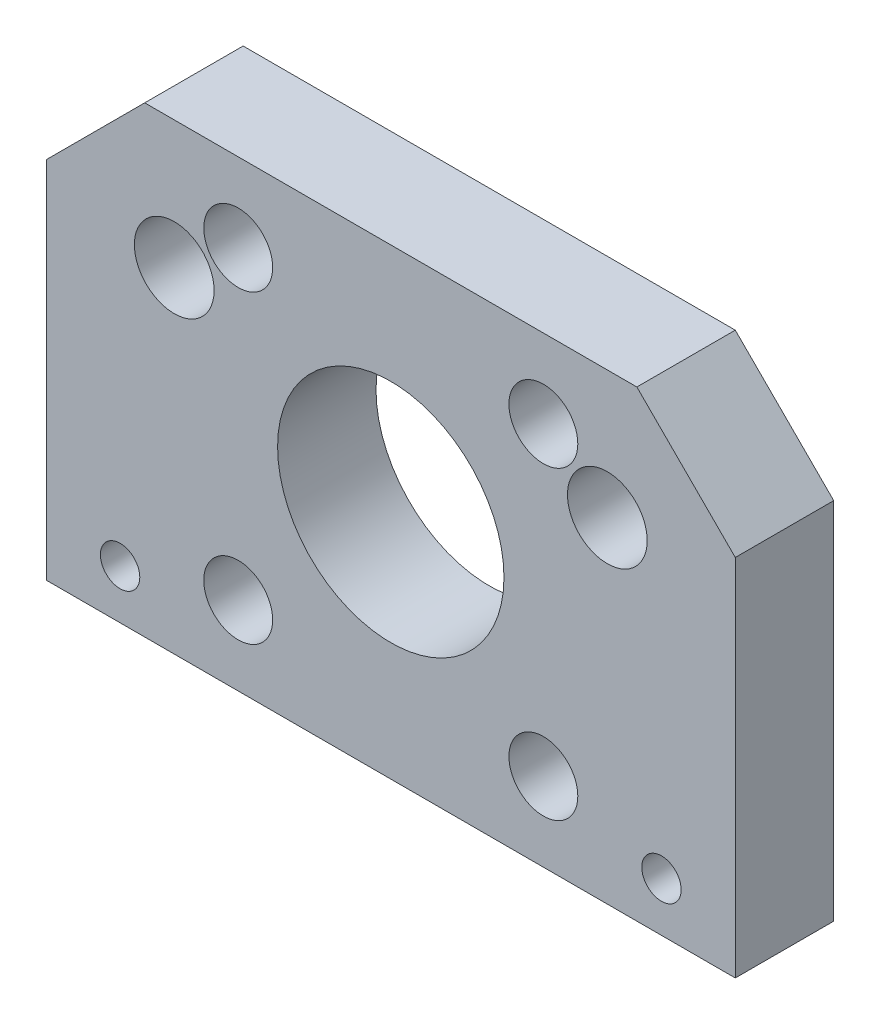
ISO-10303-21;
HEADER;
FILE_DESCRIPTION(('STEP AP214'),'2;1');
FILE_NAME('part.step','',(''),(''),'','','');
FILE_SCHEMA(('AUTOMOTIVE_DESIGN { 1 0 10303 214 1 1 1 1 }'));
ENDSEC;
DATA;
#1=APPLICATION_CONTEXT('core data for automotive mechanical design processes');
#2=APPLICATION_PROTOCOL_DEFINITION('international standard','automotive_design',2000,#1);
#3=PRODUCT_CONTEXT('',#1,'mechanical');
#4=PRODUCT('Part','Part','',(#3));
#5=PRODUCT_RELATED_PRODUCT_CATEGORY('part','',(#4));
#6=PRODUCT_DEFINITION_FORMATION('','',#4);
#7=PRODUCT_DEFINITION_CONTEXT('part definition',#1,'design');
#8=PRODUCT_DEFINITION('design','',#6,#7);
#9=PRODUCT_DEFINITION_SHAPE('','',#8);
#10=(LENGTH_UNIT() NAMED_UNIT(*) SI_UNIT(.MILLI.,.METRE.));
#11=(NAMED_UNIT(*) PLANE_ANGLE_UNIT() SI_UNIT($,.RADIAN.));
#12=(NAMED_UNIT(*) SI_UNIT($,.STERADIAN.) SOLID_ANGLE_UNIT());
#13=UNCERTAINTY_MEASURE_WITH_UNIT(LENGTH_MEASURE(1.E-05),#10,'distance_accuracy_value','');
#14=(GEOMETRIC_REPRESENTATION_CONTEXT(3) GLOBAL_UNCERTAINTY_ASSIGNED_CONTEXT((#13)) GLOBAL_UNIT_ASSIGNED_CONTEXT((#10,
#11,#12)) REPRESENTATION_CONTEXT('',''));
#15=CARTESIAN_POINT('',(0.,0.,0.));
#16=DIRECTION('',(0.,0.,1.));
#17=DIRECTION('',(1.,0.,0.));
#18=AXIS2_PLACEMENT_3D('',#15,#16,#17);
#19=CARTESIAN_POINT('',(15.5,-15.5,0.));
#20=DIRECTION('',(0.,0.,1.));
#21=DIRECTION('',(1.,0.,0.));
#22=AXIS2_PLACEMENT_3D('',#19,#20,#21);
#23=CYLINDRICAL_SURFACE('',#22,1.5);
#24=CARTESIAN_POINT('',(15.5,-15.5,0.));
#25=DIRECTION('',(0.,0.,1.));
#26=DIRECTION('',(1.,0.,0.));
#27=AXIS2_PLACEMENT_3D('',#24,#25,#26);
#28=CIRCLE('',#27,1.5);
#29=CARTESIAN_POINT('',(17.,-15.5,0.));
#30=VERTEX_POINT('',#29);
#31=EDGE_CURVE('E199',#30,#30,#28,.T.);
#32=ORIENTED_EDGE('',*,*,#31,.F.);
#33=EDGE_LOOP('',(#32));
#34=FACE_BOUND('',#33,.T.);
#35=CARTESIAN_POINT('',(15.5,-15.5,3.));
#36=DIRECTION('',(0.,0.,1.));
#37=DIRECTION('',(1.,0.,0.));
#38=AXIS2_PLACEMENT_3D('',#35,#36,#37);
#39=CIRCLE('',#38,1.5);
#40=CARTESIAN_POINT('',(17.,-15.5,3.));
#41=VERTEX_POINT('',#40);
#42=EDGE_CURVE('E148',#41,#41,#39,.F.);
#43=ORIENTED_EDGE('',*,*,#42,.F.);
#44=EDGE_LOOP('',(#43));
#45=FACE_BOUND('',#44,.T.);
#46=ADVANCED_FACE('F36',(#34,#45),#23,.F.);
#47=CARTESIAN_POINT('',(15.5,15.5,0.));
#48=DIRECTION('',(0.,0.,1.));
#49=DIRECTION('',(1.,0.,0.));
#50=AXIS2_PLACEMENT_3D('',#47,#48,#49);
#51=CYLINDRICAL_SURFACE('',#50,1.5);
#52=CARTESIAN_POINT('',(15.5,15.5,0.));
#53=DIRECTION('',(0.,0.,1.));
#54=DIRECTION('',(1.,0.,0.));
#55=AXIS2_PLACEMENT_3D('',#52,#53,#54);
#56=CIRCLE('',#55,1.5);
#57=CARTESIAN_POINT('',(17.,15.5,0.));
#58=VERTEX_POINT('',#57);
#59=EDGE_CURVE('E195',#58,#58,#56,.T.);
#60=ORIENTED_EDGE('',*,*,#59,.F.);
#61=EDGE_LOOP('',(#60));
#62=FACE_BOUND('',#61,.T.);
#63=CARTESIAN_POINT('',(15.5,15.5,3.));
#64=DIRECTION('',(0.,0.,1.));
#65=DIRECTION('',(1.,0.,0.));
#66=AXIS2_PLACEMENT_3D('',#63,#64,#65);
#67=CIRCLE('',#66,1.5);
#68=CARTESIAN_POINT('',(17.,15.5,3.));
#69=VERTEX_POINT('',#68);
#70=EDGE_CURVE('E142',#69,#69,#67,.F.);
#71=ORIENTED_EDGE('',*,*,#70,.F.);
#72=EDGE_LOOP('',(#71));
#73=FACE_BOUND('',#72,.T.);
#74=ADVANCED_FACE('F316',(#62,#73),#51,.F.);
#75=CARTESIAN_POINT('',(-15.5,15.5,0.));
#76=DIRECTION('',(0.,0.,1.));
#77=DIRECTION('',(1.,0.,0.));
#78=AXIS2_PLACEMENT_3D('',#75,#76,#77);
#79=CYLINDRICAL_SURFACE('',#78,1.5);
#80=CARTESIAN_POINT('',(-15.5,15.5,0.));
#81=DIRECTION('',(0.,0.,1.));
#82=DIRECTION('',(1.,0.,0.));
#83=AXIS2_PLACEMENT_3D('',#80,#81,#82);
#84=CIRCLE('',#83,1.5);
#85=CARTESIAN_POINT('',(-14.,15.5,0.));
#86=VERTEX_POINT('',#85);
#87=EDGE_CURVE('E189',#86,#86,#84,.T.);
#88=ORIENTED_EDGE('',*,*,#87,.F.);
#89=EDGE_LOOP('',(#88));
#90=FACE_BOUND('',#89,.T.);
#91=CARTESIAN_POINT('',(-15.5,15.5,3.));
#92=DIRECTION('',(0.,0.,1.));
#93=DIRECTION('',(1.,0.,0.));
#94=AXIS2_PLACEMENT_3D('',#91,#92,#93);
#95=CIRCLE('',#94,1.5);
#96=CARTESIAN_POINT('',(-14.,15.5,3.));
#97=VERTEX_POINT('',#96);
#98=EDGE_CURVE('E136',#97,#97,#95,.F.);
#99=ORIENTED_EDGE('',*,*,#98,.F.);
#100=EDGE_LOOP('',(#99));
#101=FACE_BOUND('',#100,.T.);
#102=ADVANCED_FACE('F322',(#90,#101),#79,.F.);
#103=CARTESIAN_POINT('',(-15.5,-15.5,0.));
#104=DIRECTION('',(0.,0.,1.));
#105=DIRECTION('',(1.,0.,0.));
#106=AXIS2_PLACEMENT_3D('',#103,#104,#105);
#107=CYLINDRICAL_SURFACE('',#106,1.5);
#108=CARTESIAN_POINT('',(-15.5,-15.5,0.));
#109=DIRECTION('',(0.,0.,1.));
#110=DIRECTION('',(1.,0.,0.));
#111=AXIS2_PLACEMENT_3D('',#108,#109,#110);
#112=CIRCLE('',#111,1.5);
#113=CARTESIAN_POINT('',(-14.,-15.5,0.));
#114=VERTEX_POINT('',#113);
#115=EDGE_CURVE('E203',#114,#114,#112,.T.);
#116=ORIENTED_EDGE('',*,*,#115,.F.);
#117=EDGE_LOOP('',(#116));
#118=FACE_BOUND('',#117,.T.);
#119=CARTESIAN_POINT('',(-15.5,-15.5,3.));
#120=DIRECTION('',(0.,0.,1.));
#121=DIRECTION('',(1.,0.,0.));
#122=AXIS2_PLACEMENT_3D('',#119,#120,#121);
#123=CIRCLE('',#122,1.5);
#124=CARTESIAN_POINT('',(-14.,-15.5,3.));
#125=VERTEX_POINT('',#124);
#126=EDGE_CURVE('E130',#125,#125,#123,.F.);
#127=ORIENTED_EDGE('',*,*,#126,.F.);
#128=EDGE_LOOP('',(#127));
#129=FACE_BOUND('',#128,.T.);
#130=ADVANCED_FACE('F329',(#118,#129),#107,.F.);
#131=CARTESIAN_POINT('',(35.,23.5,10.));
#132=DIRECTION('',(-1.,0.,0.));
#133=DIRECTION('',(0.,-1.,0.));
#134=AXIS2_PLACEMENT_3D('',#131,#132,#133);
#135=PLANE('',#134);
#136=DIRECTION('',(0.,1.,0.));
#137=VECTOR('',#136,1.);
#138=CARTESIAN_POINT('',(35.,23.5,0.));
#139=LINE('',#138,#137);
#140=CARTESIAN_POINT('',(35.,-23.5,0.));
#141=VERTEX_POINT('',#140);
#142=CARTESIAN_POINT('',(35.,13.5,0.));
#143=VERTEX_POINT('',#142);
#144=EDGE_CURVE('E120',#141,#143,#139,.T.);
#145=ORIENTED_EDGE('',*,*,#144,.T.);
#146=DIRECTION('',(0.,0.,1.));
#147=VECTOR('',#146,1.);
#148=CARTESIAN_POINT('',(35.,13.5,10.));
#149=LINE('',#148,#147);
#150=CARTESIAN_POINT('',(35.,13.5,10.));
#151=VERTEX_POINT('',#150);
#152=EDGE_CURVE('E59',#143,#151,#149,.T.);
#153=ORIENTED_EDGE('',*,*,#152,.T.);
#154=DIRECTION('',(0.,1.,0.));
#155=VECTOR('',#154,1.);
#156=CARTESIAN_POINT('',(35.,23.5,10.));
#157=LINE('',#156,#155);
#158=CARTESIAN_POINT('',(35.,-23.5,10.));
#159=VERTEX_POINT('',#158);
#160=EDGE_CURVE('E128',#159,#151,#157,.T.);
#161=ORIENTED_EDGE('',*,*,#160,.F.);
#162=DIRECTION('',(0.,0.,-1.));
#163=VECTOR('',#162,1.);
#164=CARTESIAN_POINT('',(35.,-23.5,10.));
#165=LINE('',#164,#163);
#166=EDGE_CURVE('E109',#159,#141,#165,.T.);
#167=ORIENTED_EDGE('',*,*,#166,.T.);
#168=EDGE_LOOP('',(#145,#153,#161,#167));
#169=FACE_BOUND('',#168,.T.);
#170=ADVANCED_FACE('F181',(#169),#135,.F.);
#171=CARTESIAN_POINT('',(-35.,23.5,10.));
#172=DIRECTION('',(0.,-1.,0.));
#173=DIRECTION('',(0.,0.,-1.));
#174=AXIS2_PLACEMENT_3D('',#171,#172,#173);
#175=PLANE('',#174);
#176=DIRECTION('',(-1.,0.,0.));
#177=VECTOR('',#176,1.);
#178=CARTESIAN_POINT('',(-35.,23.5,10.));
#179=LINE('',#178,#177);
#180=CARTESIAN_POINT('',(25.,23.5,10.));
#181=VERTEX_POINT('',#180);
#182=CARTESIAN_POINT('',(-25.,23.5,10.));
#183=VERTEX_POINT('',#182);
#184=EDGE_CURVE('E99',#181,#183,#179,.T.);
#185=ORIENTED_EDGE('',*,*,#184,.F.);
#186=DIRECTION('',(0.,0.,-1.));
#187=VECTOR('',#186,1.);
#188=CARTESIAN_POINT('',(25.,23.5,10.));
#189=LINE('',#188,#187);
#190=CARTESIAN_POINT('',(25.,23.5,0.));
#191=VERTEX_POINT('',#190);
#192=EDGE_CURVE('E155',#181,#191,#189,.T.);
#193=ORIENTED_EDGE('',*,*,#192,.T.);
#194=DIRECTION('',(-1.,0.,0.));
#195=VECTOR('',#194,1.);
#196=CARTESIAN_POINT('',(-35.,23.5,0.));
#197=LINE('',#196,#195);
#198=CARTESIAN_POINT('',(-25.,23.5,0.));
#199=VERTEX_POINT('',#198);
#200=EDGE_CURVE('E122',#191,#199,#197,.T.);
#201=ORIENTED_EDGE('',*,*,#200,.T.);
#202=DIRECTION('',(0.,0.,1.));
#203=VECTOR('',#202,1.);
#204=CARTESIAN_POINT('',(-25.,23.5,10.));
#205=LINE('',#204,#203);
#206=EDGE_CURVE('E108',#199,#183,#205,.T.);
#207=ORIENTED_EDGE('',*,*,#206,.T.);
#208=EDGE_LOOP('',(#185,#193,#201,#207));
#209=FACE_BOUND('',#208,.T.);
#210=ADVANCED_FACE('F172',(#209),#175,.F.);
#211=CARTESIAN_POINT('',(-35.,23.5,10.));
#212=DIRECTION('',(1.,0.,0.));
#213=DIRECTION('',(0.,1.,0.));
#214=AXIS2_PLACEMENT_3D('',#211,#212,#213);
#215=PLANE('',#214);
#216=DIRECTION('',(0.,-1.,0.));
#217=VECTOR('',#216,1.);
#218=CARTESIAN_POINT('',(-35.,23.5,10.));
#219=LINE('',#218,#217);
#220=CARTESIAN_POINT('',(-35.,13.5,10.));
#221=VERTEX_POINT('',#220);
#222=CARTESIAN_POINT('',(-35.,-23.5,10.));
#223=VERTEX_POINT('',#222);
#224=EDGE_CURVE('E89',#221,#223,#219,.T.);
#225=ORIENTED_EDGE('',*,*,#224,.F.);
#226=DIRECTION('',(0.,0.,-1.));
#227=VECTOR('',#226,1.);
#228=CARTESIAN_POINT('',(-35.,13.5,10.));
#229=LINE('',#228,#227);
#230=CARTESIAN_POINT('',(-35.,13.5,0.));
#231=VERTEX_POINT('',#230);
#232=EDGE_CURVE('E11',#221,#231,#229,.T.);
#233=ORIENTED_EDGE('',*,*,#232,.T.);
#234=DIRECTION('',(0.,-1.,0.));
#235=VECTOR('',#234,1.);
#236=CARTESIAN_POINT('',(-35.,23.5,0.));
#237=LINE('',#236,#235);
#238=CARTESIAN_POINT('',(-35.,-23.5,0.));
#239=VERTEX_POINT('',#238);
#240=EDGE_CURVE('E105',#231,#239,#237,.T.);
#241=ORIENTED_EDGE('',*,*,#240,.T.);
#242=DIRECTION('',(0.,0.,-1.));
#243=VECTOR('',#242,1.);
#244=CARTESIAN_POINT('',(-35.,-23.5,10.));
#245=LINE('',#244,#243);
#246=EDGE_CURVE('E102',#223,#239,#245,.T.);
#247=ORIENTED_EDGE('',*,*,#246,.F.);
#248=EDGE_LOOP('',(#225,#233,#241,#247));
#249=FACE_BOUND('',#248,.T.);
#250=ADVANCED_FACE('F103',(#249),#215,.F.);
#251=CARTESIAN_POINT('',(-35.,-23.5,10.));
#252=DIRECTION('',(0.,1.,0.));
#253=DIRECTION('',(0.,0.,1.));
#254=AXIS2_PLACEMENT_3D('',#251,#252,#253);
#255=PLANE('',#254);
#256=DIRECTION('',(1.,0.,0.));
#257=VECTOR('',#256,1.);
#258=CARTESIAN_POINT('',(-35.,-23.5,0.));
#259=LINE('',#258,#257);
#260=EDGE_CURVE('E127',#239,#141,#259,.T.);
#261=ORIENTED_EDGE('',*,*,#260,.T.);
#262=ORIENTED_EDGE('',*,*,#166,.F.);
#263=DIRECTION('',(1.,0.,0.));
#264=VECTOR('',#263,1.);
#265=CARTESIAN_POINT('',(-35.,-23.5,10.));
#266=LINE('',#265,#264);
#267=EDGE_CURVE('E94',#223,#159,#266,.T.);
#268=ORIENTED_EDGE('',*,*,#267,.F.);
#269=ORIENTED_EDGE('',*,*,#246,.T.);
#270=EDGE_LOOP('',(#261,#262,#268,#269));
#271=FACE_BOUND('',#270,.T.);
#272=ADVANCED_FACE('F111',(#271),#255,.F.);
#273=CARTESIAN_POINT('',(0.,0.,10.));
#274=DIRECTION('',(0.,0.,1.));
#275=DIRECTION('',(1.,0.,0.));
#276=AXIS2_PLACEMENT_3D('',#273,#274,#275);
#277=PLANE('',#276);
#278=CARTESIAN_POINT('',(15.5,-15.5,10.));
#279=DIRECTION('',(0.,0.,1.));
#280=DIRECTION('',(1.,0.,0.));
#281=AXIS2_PLACEMENT_3D('',#278,#279,#280);
#282=CIRCLE('',#281,3.5);
#283=CARTESIAN_POINT('',(19.,-15.5,10.));
#284=VERTEX_POINT('',#283);
#285=EDGE_CURVE('E252',#284,#284,#282,.T.);
#286=ORIENTED_EDGE('',*,*,#285,.F.);
#287=EDGE_LOOP('',(#286));
#288=FACE_BOUND('',#287,.T.);
#289=CARTESIAN_POINT('',(15.5,15.5,10.));
#290=DIRECTION('',(0.,0.,1.));
#291=DIRECTION('',(1.,0.,0.));
#292=AXIS2_PLACEMENT_3D('',#289,#290,#291);
#293=CIRCLE('',#292,3.5);
#294=CARTESIAN_POINT('',(19.,15.5,10.));
#295=VERTEX_POINT('',#294);
#296=EDGE_CURVE('E152',#295,#295,#293,.T.);
#297=ORIENTED_EDGE('',*,*,#296,.F.);
#298=EDGE_LOOP('',(#297));
#299=FACE_BOUND('',#298,.T.);
#300=CARTESIAN_POINT('',(-15.5,15.5,10.));
#301=DIRECTION('',(0.,0.,1.));
#302=DIRECTION('',(1.,0.,0.));
#303=AXIS2_PLACEMENT_3D('',#300,#301,#302);
#304=CIRCLE('',#303,3.5);
#305=CARTESIAN_POINT('',(-12.,15.5,10.));
#306=VERTEX_POINT('',#305);
#307=EDGE_CURVE('E146',#306,#306,#304,.T.);
#308=ORIENTED_EDGE('',*,*,#307,.F.);
#309=EDGE_LOOP('',(#308));
#310=FACE_BOUND('',#309,.T.);
#311=CARTESIAN_POINT('',(-15.5,-15.5,10.));
#312=DIRECTION('',(0.,0.,1.));
#313=DIRECTION('',(1.,0.,0.));
#314=AXIS2_PLACEMENT_3D('',#311,#312,#313);
#315=CIRCLE('',#314,3.5);
#316=CARTESIAN_POINT('',(-12.,-15.5,10.));
#317=VERTEX_POINT('',#316);
#318=EDGE_CURVE('E140',#317,#317,#315,.T.);
#319=ORIENTED_EDGE('',*,*,#318,.F.);
#320=EDGE_LOOP('',(#319));
#321=FACE_BOUND('',#320,.T.);
#322=CARTESIAN_POINT('',(27.5,-18.5,10.));
#323=DIRECTION('',(0.,0.,1.));
#324=DIRECTION('',(1.,0.,0.));
#325=AXIS2_PLACEMENT_3D('',#322,#323,#324);
#326=CIRCLE('',#325,2.);
#327=CARTESIAN_POINT('',(29.5,-18.5,10.));
#328=VERTEX_POINT('',#327);
#329=EDGE_CURVE('E134',#328,#328,#326,.T.);
#330=ORIENTED_EDGE('',*,*,#329,.F.);
#331=EDGE_LOOP('',(#330));
#332=FACE_BOUND('',#331,.T.);
#333=CARTESIAN_POINT('',(-27.5,-18.5,10.));
#334=DIRECTION('',(0.,0.,1.));
#335=DIRECTION('',(1.,0.,0.));
#336=AXIS2_PLACEMENT_3D('',#333,#334,#335);
#337=CIRCLE('',#336,2.);
#338=CARTESIAN_POINT('',(-25.5,-18.5,10.));
#339=VERTEX_POINT('',#338);
#340=EDGE_CURVE('E223',#339,#339,#337,.T.);
#341=ORIENTED_EDGE('',*,*,#340,.F.);
#342=EDGE_LOOP('',(#341));
#343=FACE_BOUND('',#342,.T.);
#344=CARTESIAN_POINT('',(22.,10.5,10.));
#345=DIRECTION('',(0.,0.,1.));
#346=DIRECTION('',(1.,0.,0.));
#347=AXIS2_PLACEMENT_3D('',#344,#345,#346);
#348=CIRCLE('',#347,4.05);
#349=CARTESIAN_POINT('',(26.05,10.5,10.));
#350=VERTEX_POINT('',#349);
#351=EDGE_CURVE('E216',#350,#350,#348,.T.);
#352=ORIENTED_EDGE('',*,*,#351,.F.);
#353=EDGE_LOOP('',(#352));
#354=FACE_BOUND('',#353,.T.);
#355=CARTESIAN_POINT('',(-22.,10.5,10.));
#356=DIRECTION('',(0.,0.,1.));
#357=DIRECTION('',(1.,0.,0.));
#358=AXIS2_PLACEMENT_3D('',#355,#356,#357);
#359=CIRCLE('',#358,4.05);
#360=CARTESIAN_POINT('',(-17.95,10.5,10.));
#361=VERTEX_POINT('',#360);
#362=EDGE_CURVE('E208',#361,#361,#359,.T.);
#363=ORIENTED_EDGE('',*,*,#362,.F.);
#364=EDGE_LOOP('',(#363));
#365=FACE_BOUND('',#364,.T.);
#366=CARTESIAN_POINT('',(0.,0.,10.));
#367=DIRECTION('',(0.,0.,1.));
#368=DIRECTION('',(1.,0.,0.));
#369=AXIS2_PLACEMENT_3D('',#366,#367,#368);
#370=CIRCLE('',#369,11.5);
#371=CARTESIAN_POINT('',(11.5,0.,10.));
#372=VERTEX_POINT('',#371);
#373=EDGE_CURVE('E186',#372,#372,#370,.T.);
#374=ORIENTED_EDGE('',*,*,#373,.F.);
#375=EDGE_LOOP('',(#374));
#376=FACE_BOUND('',#375,.T.);
#377=ORIENTED_EDGE('',*,*,#160,.T.);
#378=DIRECTION('',(0.707106781186546,-0.707106781186549,0.));
#379=VECTOR('',#378,1.);
#380=CARTESIAN_POINT('',(24.2500000000001,24.25,10.));
#381=LINE('',#380,#379);
#382=EDGE_CURVE('E44',#151,#181,#381,.F.);
#383=ORIENTED_EDGE('',*,*,#382,.T.);
#384=ORIENTED_EDGE('',*,*,#184,.T.);
#385=DIRECTION('',(0.707106781186549,0.707106781186546,0.));
#386=VECTOR('',#385,1.);
#387=CARTESIAN_POINT('',(-24.2499999999999,24.25,10.));
#388=LINE('',#387,#386);
#389=EDGE_CURVE('E51',#183,#221,#388,.F.);
#390=ORIENTED_EDGE('',*,*,#389,.T.);
#391=ORIENTED_EDGE('',*,*,#224,.T.);
#392=ORIENTED_EDGE('',*,*,#267,.T.);
#393=EDGE_LOOP('',(#377,#383,#384,#390,#391,#392));
#394=FACE_BOUND('',#393,.T.);
#395=ADVANCED_FACE('F92',(#288,#299,#310,#321,#332,#343,#354,#365,#376,#394),#277,.T.);
#396=CARTESIAN_POINT('',(0.,0.,0.));
#397=DIRECTION('',(0.,0.,1.));
#398=DIRECTION('',(1.,0.,0.));
#399=AXIS2_PLACEMENT_3D('',#396,#397,#398);
#400=PLANE('',#399);
#401=CARTESIAN_POINT('',(27.5,-18.5,0.));
#402=DIRECTION('',(0.,0.,1.));
#403=DIRECTION('',(1.,0.,0.));
#404=AXIS2_PLACEMENT_3D('',#401,#402,#403);
#405=CIRCLE('',#404,2.);
#406=CARTESIAN_POINT('',(29.5,-18.5,0.));
#407=VERTEX_POINT('',#406);
#408=EDGE_CURVE('E227',#407,#407,#405,.T.);
#409=ORIENTED_EDGE('',*,*,#408,.T.);
#410=EDGE_LOOP('',(#409));
#411=FACE_BOUND('',#410,.T.);
#412=CARTESIAN_POINT('',(-27.5,-18.5,0.));
#413=DIRECTION('',(0.,0.,1.));
#414=DIRECTION('',(1.,0.,0.));
#415=AXIS2_PLACEMENT_3D('',#412,#413,#414);
#416=CIRCLE('',#415,2.);
#417=CARTESIAN_POINT('',(-25.5,-18.5,0.));
#418=VERTEX_POINT('',#417);
#419=EDGE_CURVE('E219',#418,#418,#416,.T.);
#420=ORIENTED_EDGE('',*,*,#419,.T.);
#421=EDGE_LOOP('',(#420));
#422=FACE_BOUND('',#421,.T.);
#423=CARTESIAN_POINT('',(22.,10.5,0.));
#424=DIRECTION('',(0.,0.,1.));
#425=DIRECTION('',(1.,0.,0.));
#426=AXIS2_PLACEMENT_3D('',#423,#424,#425);
#427=CIRCLE('',#426,4.05);
#428=CARTESIAN_POINT('',(26.05,10.5,0.));
#429=VERTEX_POINT('',#428);
#430=EDGE_CURVE('E212',#429,#429,#427,.T.);
#431=ORIENTED_EDGE('',*,*,#430,.T.);
#432=EDGE_LOOP('',(#431));
#433=FACE_BOUND('',#432,.T.);
#434=CARTESIAN_POINT('',(-22.,10.5,0.));
#435=DIRECTION('',(0.,0.,1.));
#436=DIRECTION('',(1.,0.,0.));
#437=AXIS2_PLACEMENT_3D('',#434,#435,#436);
#438=CIRCLE('',#437,4.05);
#439=CARTESIAN_POINT('',(-17.95,10.5,0.));
#440=VERTEX_POINT('',#439);
#441=EDGE_CURVE('E207',#440,#440,#438,.T.);
#442=ORIENTED_EDGE('',*,*,#441,.T.);
#443=EDGE_LOOP('',(#442));
#444=FACE_BOUND('',#443,.T.);
#445=ORIENTED_EDGE('',*,*,#115,.T.);
#446=EDGE_LOOP('',(#445));
#447=FACE_BOUND('',#446,.T.);
#448=ORIENTED_EDGE('',*,*,#31,.T.);
#449=EDGE_LOOP('',(#448));
#450=FACE_BOUND('',#449,.T.);
#451=ORIENTED_EDGE('',*,*,#59,.T.);
#452=EDGE_LOOP('',(#451));
#453=FACE_BOUND('',#452,.T.);
#454=ORIENTED_EDGE('',*,*,#87,.T.);
#455=EDGE_LOOP('',(#454));
#456=FACE_BOUND('',#455,.T.);
#457=CARTESIAN_POINT('',(0.,0.,0.));
#458=DIRECTION('',(0.,0.,1.));
#459=DIRECTION('',(1.,0.,0.));
#460=AXIS2_PLACEMENT_3D('',#457,#458,#459);
#461=CIRCLE('',#460,11.5);
#462=CARTESIAN_POINT('',(11.5,0.,0.));
#463=VERTEX_POINT('',#462);
#464=EDGE_CURVE('E123',#463,#463,#461,.T.);
#465=ORIENTED_EDGE('',*,*,#464,.T.);
#466=EDGE_LOOP('',(#465));
#467=FACE_BOUND('',#466,.T.);
#468=ORIENTED_EDGE('',*,*,#200,.F.);
#469=DIRECTION('',(-0.707106781186546,0.707106781186549,0.));
#470=VECTOR('',#469,1.);
#471=CARTESIAN_POINT('',(25.,23.5,0.));
#472=LINE('',#471,#470);
#473=EDGE_CURVE('E160',#191,#143,#472,.F.);
#474=ORIENTED_EDGE('',*,*,#473,.T.);
#475=ORIENTED_EDGE('',*,*,#144,.F.);
#476=ORIENTED_EDGE('',*,*,#260,.F.);
#477=ORIENTED_EDGE('',*,*,#240,.F.);
#478=DIRECTION('',(-0.707106781186549,-0.707106781186546,0.));
#479=VECTOR('',#478,1.);
#480=CARTESIAN_POINT('',(-35.,13.5,0.));
#481=LINE('',#480,#479);
#482=EDGE_CURVE('E158',#231,#199,#481,.F.);
#483=ORIENTED_EDGE('',*,*,#482,.T.);
#484=EDGE_LOOP('',(#468,#474,#475,#476,#477,#483));
#485=FACE_BOUND('',#484,.T.);
#486=ADVANCED_FACE('F180',(#411,#422,#433,#444,#447,#450,#453,#456,#467,#485),#400,.F.);
#487=CARTESIAN_POINT('',(0.,0.,0.));
#488=DIRECTION('',(0.,0.,1.));
#489=DIRECTION('',(1.,0.,0.));
#490=AXIS2_PLACEMENT_3D('',#487,#488,#489);
#491=CYLINDRICAL_SURFACE('',#490,11.5);
#492=ORIENTED_EDGE('',*,*,#464,.F.);
#493=EDGE_LOOP('',(#492));
#494=FACE_BOUND('',#493,.T.);
#495=ORIENTED_EDGE('',*,*,#373,.T.);
#496=EDGE_LOOP('',(#495));
#497=FACE_BOUND('',#496,.T.);
#498=ADVANCED_FACE('F299',(#494,#497),#491,.F.);
#499=CARTESIAN_POINT('',(-22.,10.5,0.));
#500=DIRECTION('',(0.,0.,1.));
#501=DIRECTION('',(1.,0.,0.));
#502=AXIS2_PLACEMENT_3D('',#499,#500,#501);
#503=CYLINDRICAL_SURFACE('',#502,4.05);
#504=ORIENTED_EDGE('',*,*,#441,.F.);
#505=EDGE_LOOP('',(#504));
#506=FACE_BOUND('',#505,.T.);
#507=ORIENTED_EDGE('',*,*,#362,.T.);
#508=EDGE_LOOP('',(#507));
#509=FACE_BOUND('',#508,.T.);
#510=ADVANCED_FACE('F301',(#506,#509),#503,.F.);
#511=CARTESIAN_POINT('',(22.,10.5,0.));
#512=DIRECTION('',(0.,0.,1.));
#513=DIRECTION('',(1.,0.,0.));
#514=AXIS2_PLACEMENT_3D('',#511,#512,#513);
#515=CYLINDRICAL_SURFACE('',#514,4.05);
#516=ORIENTED_EDGE('',*,*,#430,.F.);
#517=EDGE_LOOP('',(#516));
#518=FACE_BOUND('',#517,.T.);
#519=ORIENTED_EDGE('',*,*,#351,.T.);
#520=EDGE_LOOP('',(#519));
#521=FACE_BOUND('',#520,.T.);
#522=ADVANCED_FACE('F308',(#518,#521),#515,.F.);
#523=CARTESIAN_POINT('',(-27.5,-18.5,0.));
#524=DIRECTION('',(0.,0.,1.));
#525=DIRECTION('',(1.,0.,0.));
#526=AXIS2_PLACEMENT_3D('',#523,#524,#525);
#527=CYLINDRICAL_SURFACE('',#526,2.);
#528=ORIENTED_EDGE('',*,*,#419,.F.);
#529=EDGE_LOOP('',(#528));
#530=FACE_BOUND('',#529,.T.);
#531=ORIENTED_EDGE('',*,*,#340,.T.);
#532=EDGE_LOOP('',(#531));
#533=FACE_BOUND('',#532,.T.);
#534=ADVANCED_FACE('F373',(#530,#533),#527,.F.);
#535=CARTESIAN_POINT('',(27.5,-18.5,0.));
#536=DIRECTION('',(0.,0.,1.));
#537=DIRECTION('',(1.,0.,0.));
#538=AXIS2_PLACEMENT_3D('',#535,#536,#537);
#539=CYLINDRICAL_SURFACE('',#538,2.);
#540=ORIENTED_EDGE('',*,*,#408,.F.);
#541=EDGE_LOOP('',(#540));
#542=FACE_BOUND('',#541,.T.);
#543=ORIENTED_EDGE('',*,*,#329,.T.);
#544=EDGE_LOOP('',(#543));
#545=FACE_BOUND('',#544,.T.);
#546=ADVANCED_FACE('F368',(#542,#545),#539,.F.);
#547=CARTESIAN_POINT('',(-15.5,-15.5,3.));
#548=DIRECTION('',(0.,0.,1.));
#549=DIRECTION('',(1.,0.,0.));
#550=AXIS2_PLACEMENT_3D('',#547,#548,#549);
#551=PLANE('',#550);
#552=CARTESIAN_POINT('',(-15.5,-15.5,3.));
#553=DIRECTION('',(0.,0.,1.));
#554=DIRECTION('',(1.,0.,0.));
#555=AXIS2_PLACEMENT_3D('',#552,#553,#554);
#556=CIRCLE('',#555,3.5);
#557=CARTESIAN_POINT('',(-12.,-15.5,3.));
#558=VERTEX_POINT('',#557);
#559=EDGE_CURVE('E135',#558,#558,#556,.T.);
#560=ORIENTED_EDGE('',*,*,#559,.T.);
#561=EDGE_LOOP('',(#560));
#562=FACE_BOUND('',#561,.T.);
#563=ORIENTED_EDGE('',*,*,#126,.T.);
#564=EDGE_LOOP('',(#563));
#565=FACE_BOUND('',#564,.T.);
#566=ADVANCED_FACE('F360',(#562,#565),#551,.T.);
#567=CARTESIAN_POINT('',(-15.5,-15.5,3.));
#568=DIRECTION('',(0.,0.,1.));
#569=DIRECTION('',(1.,0.,0.));
#570=AXIS2_PLACEMENT_3D('',#567,#568,#569);
#571=CYLINDRICAL_SURFACE('',#570,3.5);
#572=ORIENTED_EDGE('',*,*,#559,.F.);
#573=EDGE_LOOP('',(#572));
#574=FACE_BOUND('',#573,.T.);
#575=ORIENTED_EDGE('',*,*,#318,.T.);
#576=EDGE_LOOP('',(#575));
#577=FACE_BOUND('',#576,.T.);
#578=ADVANCED_FACE('F350',(#574,#577),#571,.F.);
#579=CARTESIAN_POINT('',(-15.5,15.5,3.));
#580=DIRECTION('',(0.,0.,1.));
#581=DIRECTION('',(1.,0.,0.));
#582=AXIS2_PLACEMENT_3D('',#579,#580,#581);
#583=PLANE('',#582);
#584=CARTESIAN_POINT('',(-15.5,15.5,3.));
#585=DIRECTION('',(0.,0.,1.));
#586=DIRECTION('',(1.,0.,0.));
#587=AXIS2_PLACEMENT_3D('',#584,#585,#586);
#588=CIRCLE('',#587,3.5);
#589=CARTESIAN_POINT('',(-12.,15.5,3.));
#590=VERTEX_POINT('',#589);
#591=EDGE_CURVE('E141',#590,#590,#588,.T.);
#592=ORIENTED_EDGE('',*,*,#591,.T.);
#593=EDGE_LOOP('',(#592));
#594=FACE_BOUND('',#593,.T.);
#595=ORIENTED_EDGE('',*,*,#98,.T.);
#596=EDGE_LOOP('',(#595));
#597=FACE_BOUND('',#596,.T.);
#598=ADVANCED_FACE('F346',(#594,#597),#583,.T.);
#599=CARTESIAN_POINT('',(-15.5,15.5,3.));
#600=DIRECTION('',(0.,0.,1.));
#601=DIRECTION('',(1.,0.,0.));
#602=AXIS2_PLACEMENT_3D('',#599,#600,#601);
#603=CYLINDRICAL_SURFACE('',#602,3.5);
#604=ORIENTED_EDGE('',*,*,#591,.F.);
#605=EDGE_LOOP('',(#604));
#606=FACE_BOUND('',#605,.T.);
#607=ORIENTED_EDGE('',*,*,#307,.T.);
#608=EDGE_LOOP('',(#607));
#609=FACE_BOUND('',#608,.T.);
#610=ADVANCED_FACE('F349',(#606,#609),#603,.F.);
#611=CARTESIAN_POINT('',(15.5,15.5,3.));
#612=DIRECTION('',(0.,0.,1.));
#613=DIRECTION('',(1.,0.,0.));
#614=AXIS2_PLACEMENT_3D('',#611,#612,#613);
#615=PLANE('',#614);
#616=CARTESIAN_POINT('',(15.5,15.5,3.));
#617=DIRECTION('',(0.,0.,1.));
#618=DIRECTION('',(1.,0.,0.));
#619=AXIS2_PLACEMENT_3D('',#616,#617,#618);
#620=CIRCLE('',#619,3.5);
#621=CARTESIAN_POINT('',(19.,15.5,3.));
#622=VERTEX_POINT('',#621);
#623=EDGE_CURVE('E147',#622,#622,#620,.T.);
#624=ORIENTED_EDGE('',*,*,#623,.T.);
#625=EDGE_LOOP('',(#624));
#626=FACE_BOUND('',#625,.T.);
#627=ORIENTED_EDGE('',*,*,#70,.T.);
#628=EDGE_LOOP('',(#627));
#629=FACE_BOUND('',#628,.T.);
#630=ADVANCED_FACE('F357',(#626,#629),#615,.T.);
#631=CARTESIAN_POINT('',(15.5,15.5,3.));
#632=DIRECTION('',(0.,0.,1.));
#633=DIRECTION('',(1.,0.,0.));
#634=AXIS2_PLACEMENT_3D('',#631,#632,#633);
#635=CYLINDRICAL_SURFACE('',#634,3.5);
#636=ORIENTED_EDGE('',*,*,#623,.F.);
#637=EDGE_LOOP('',(#636));
#638=FACE_BOUND('',#637,.T.);
#639=ORIENTED_EDGE('',*,*,#296,.T.);
#640=EDGE_LOOP('',(#639));
#641=FACE_BOUND('',#640,.T.);
#642=ADVANCED_FACE('F364',(#638,#641),#635,.F.);
#643=CARTESIAN_POINT('',(15.5,-15.5,3.));
#644=DIRECTION('',(0.,0.,1.));
#645=DIRECTION('',(1.,0.,0.));
#646=AXIS2_PLACEMENT_3D('',#643,#644,#645);
#647=PLANE('',#646);
#648=CARTESIAN_POINT('',(15.5,-15.5,3.));
#649=DIRECTION('',(0.,0.,1.));
#650=DIRECTION('',(1.,0.,0.));
#651=AXIS2_PLACEMENT_3D('',#648,#649,#650);
#652=CIRCLE('',#651,3.5);
#653=CARTESIAN_POINT('',(19.,-15.5,3.));
#654=VERTEX_POINT('',#653);
#655=EDGE_CURVE('E153',#654,#654,#652,.T.);
#656=ORIENTED_EDGE('',*,*,#655,.T.);
#657=EDGE_LOOP('',(#656));
#658=FACE_BOUND('',#657,.T.);
#659=ORIENTED_EDGE('',*,*,#42,.T.);
#660=EDGE_LOOP('',(#659));
#661=FACE_BOUND('',#660,.T.);
#662=ADVANCED_FACE('F259',(#658,#661),#647,.T.);
#663=CARTESIAN_POINT('',(15.5,-15.5,3.));
#664=DIRECTION('',(0.,0.,1.));
#665=DIRECTION('',(1.,0.,0.));
#666=AXIS2_PLACEMENT_3D('',#663,#664,#665);
#667=CYLINDRICAL_SURFACE('',#666,3.5);
#668=ORIENTED_EDGE('',*,*,#655,.F.);
#669=EDGE_LOOP('',(#668));
#670=FACE_BOUND('',#669,.T.);
#671=ORIENTED_EDGE('',*,*,#285,.T.);
#672=EDGE_LOOP('',(#671));
#673=FACE_BOUND('',#672,.T.);
#674=ADVANCED_FACE('F262',(#670,#673),#667,.F.);
#675=CARTESIAN_POINT('',(25.,23.5,10.));
#676=DIRECTION('',(-0.707106781186549,-0.707106781186546,0.));
#677=DIRECTION('',(0.,0.,-1.));
#678=AXIS2_PLACEMENT_3D('',#675,#676,#677);
#679=PLANE('',#678);
#680=ORIENTED_EDGE('',*,*,#382,.F.);
#681=ORIENTED_EDGE('',*,*,#152,.F.);
#682=ORIENTED_EDGE('',*,*,#473,.F.);
#683=ORIENTED_EDGE('',*,*,#192,.F.);
#684=EDGE_LOOP('',(#680,#681,#682,#683));
#685=FACE_BOUND('',#684,.T.);
#686=ADVANCED_FACE('F177',(#685),#679,.F.);
#687=CARTESIAN_POINT('',(-35.,13.5,10.));
#688=DIRECTION('',(0.707106781186546,-0.707106781186549,0.));
#689=DIRECTION('',(0.,0.,-1.));
#690=AXIS2_PLACEMENT_3D('',#687,#688,#689);
#691=PLANE('',#690);
#692=ORIENTED_EDGE('',*,*,#389,.F.);
#693=ORIENTED_EDGE('',*,*,#206,.F.);
#694=ORIENTED_EDGE('',*,*,#482,.F.);
#695=ORIENTED_EDGE('',*,*,#232,.F.);
#696=EDGE_LOOP('',(#692,#693,#694,#695));
#697=FACE_BOUND('',#696,.T.);
#698=ADVANCED_FACE('F38',(#697),#691,.F.);
#699=CLOSED_SHELL('',(#46,#74,#102,#130,#170,#210,#250,#272,#395,#486,#498,#510,#522,#534,#546,
#566,#578,#598,#610,#630,#642,#662,#674,#686,#698));
#700=MANIFOLD_SOLID_BREP('B2',#699);
#701=ADVANCED_BREP_SHAPE_REPRESENTATION('',(#18,#700),#14);
#702=SHAPE_DEFINITION_REPRESENTATION(#9,#701);
ENDSEC;
END-ISO-10303-21;
